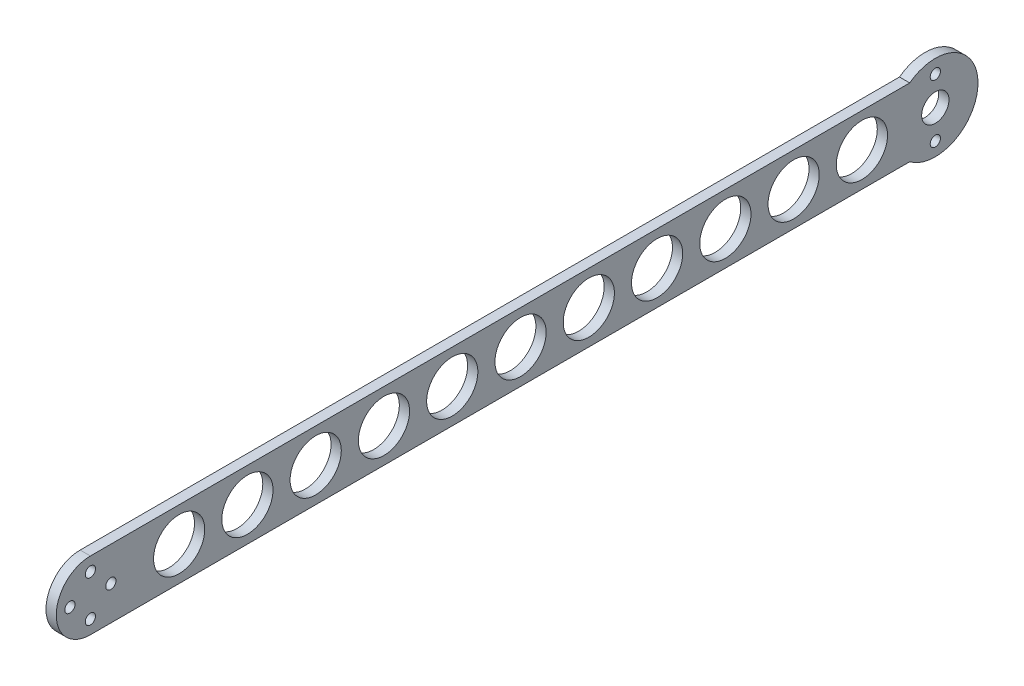
ISO-10303-21;
HEADER;
FILE_DESCRIPTION(('STEP AP214'),'2;1');
FILE_NAME('part.step','',(''),(''),'','','');
FILE_SCHEMA(('AUTOMOTIVE_DESIGN { 1 0 10303 214 1 1 1 1 }'));
ENDSEC;
DATA;
#1=APPLICATION_CONTEXT('core data for automotive mechanical design processes');
#2=APPLICATION_PROTOCOL_DEFINITION('international standard','automotive_design',2000,#1);
#3=PRODUCT_CONTEXT('',#1,'mechanical');
#4=PRODUCT('Part','Part','',(#3));
#5=PRODUCT_RELATED_PRODUCT_CATEGORY('part','',(#4));
#6=PRODUCT_DEFINITION_FORMATION('','',#4);
#7=PRODUCT_DEFINITION_CONTEXT('part definition',#1,'design');
#8=PRODUCT_DEFINITION('design','',#6,#7);
#9=PRODUCT_DEFINITION_SHAPE('','',#8);
#10=(LENGTH_UNIT() NAMED_UNIT(*) SI_UNIT(.MILLI.,.METRE.));
#11=(NAMED_UNIT(*) PLANE_ANGLE_UNIT() SI_UNIT($,.RADIAN.));
#12=(NAMED_UNIT(*) SI_UNIT($,.STERADIAN.) SOLID_ANGLE_UNIT());
#13=UNCERTAINTY_MEASURE_WITH_UNIT(LENGTH_MEASURE(1.E-05),#10,'distance_accuracy_value','');
#14=(GEOMETRIC_REPRESENTATION_CONTEXT(3) GLOBAL_UNCERTAINTY_ASSIGNED_CONTEXT((#13)) GLOBAL_UNIT_ASSIGNED_CONTEXT((#10,
#11,#12)) REPRESENTATION_CONTEXT('',''));
#15=CARTESIAN_POINT('',(0.,0.,0.));
#16=DIRECTION('',(0.,0.,1.));
#17=DIRECTION('',(1.,0.,0.));
#18=AXIS2_PLACEMENT_3D('',#15,#16,#17);
#19=CARTESIAN_POINT('',(3.,0.,-127.5));
#20=DIRECTION('',(-1.,0.,0.));
#21=DIRECTION('',(0.,0.,1.));
#22=AXIS2_PLACEMENT_3D('',#19,#20,#21);
#23=CYLINDRICAL_SURFACE('',#22,12.5);
#24=CARTESIAN_POINT('',(0.,0.,-127.5));
#25=DIRECTION('',(1.,0.,0.));
#26=DIRECTION('',(0.,0.,-1.));
#27=AXIS2_PLACEMENT_3D('',#24,#25,#26);
#28=CIRCLE('',#27,12.5);
#29=CARTESIAN_POINT('',(0.,-10.,-120.));
#30=VERTEX_POINT('',#29);
#31=CARTESIAN_POINT('',(0.,10.,-120.));
#32=VERTEX_POINT('',#31);
#33=EDGE_CURVE('E113',#30,#32,#28,.T.);
#34=ORIENTED_EDGE('',*,*,#33,.T.);
#35=DIRECTION('',(-1.,0.,0.));
#36=VECTOR('',#35,1.);
#37=CARTESIAN_POINT('',(3.,10.,-120.));
#38=LINE('',#37,#36);
#39=CARTESIAN_POINT('',(3.,10.,-120.));
#40=VERTEX_POINT('',#39);
#41=EDGE_CURVE('E11',#40,#32,#38,.T.);
#42=ORIENTED_EDGE('',*,*,#41,.F.);
#43=CARTESIAN_POINT('',(3.,0.,-127.5));
#44=DIRECTION('',(1.,0.,0.));
#45=DIRECTION('',(0.,0.,-1.));
#46=AXIS2_PLACEMENT_3D('',#43,#44,#45);
#47=CIRCLE('',#46,12.5);
#48=CARTESIAN_POINT('',(3.,-10.,-120.));
#49=VERTEX_POINT('',#48);
#50=EDGE_CURVE('E96',#49,#40,#47,.T.);
#51=ORIENTED_EDGE('',*,*,#50,.F.);
#52=DIRECTION('',(-1.,0.,0.));
#53=VECTOR('',#52,1.);
#54=CARTESIAN_POINT('',(3.,-10.,-120.));
#55=LINE('',#54,#53);
#56=EDGE_CURVE('E109',#49,#30,#55,.T.);
#57=ORIENTED_EDGE('',*,*,#56,.T.);
#58=EDGE_LOOP('',(#34,#42,#51,#57));
#59=FACE_BOUND('',#58,.T.);
#60=ADVANCED_FACE('F42',(#59),#23,.T.);
#61=CARTESIAN_POINT('',(3.,10.,120.));
#62=DIRECTION('',(0.,-1.,0.));
#63=DIRECTION('',(0.,0.,-1.));
#64=AXIS2_PLACEMENT_3D('',#61,#62,#63);
#65=PLANE('',#64);
#66=DIRECTION('',(0.,0.,1.));
#67=VECTOR('',#66,1.);
#68=CARTESIAN_POINT('',(0.,10.,120.));
#69=LINE('',#68,#67);
#70=CARTESIAN_POINT('',(0.,10.,120.));
#71=VERTEX_POINT('',#70);
#72=EDGE_CURVE('E101',#32,#71,#69,.T.);
#73=ORIENTED_EDGE('',*,*,#72,.T.);
#74=DIRECTION('',(-1.,0.,0.));
#75=VECTOR('',#74,1.);
#76=CARTESIAN_POINT('',(3.,10.,120.));
#77=LINE('',#76,#75);
#78=CARTESIAN_POINT('',(3.,10.,120.));
#79=VERTEX_POINT('',#78);
#80=EDGE_CURVE('E52',#79,#71,#77,.T.);
#81=ORIENTED_EDGE('',*,*,#80,.F.);
#82=DIRECTION('',(0.,0.,1.));
#83=VECTOR('',#82,1.);
#84=CARTESIAN_POINT('',(3.,10.,120.));
#85=LINE('',#84,#83);
#86=EDGE_CURVE('E91',#40,#79,#85,.T.);
#87=ORIENTED_EDGE('',*,*,#86,.F.);
#88=ORIENTED_EDGE('',*,*,#41,.T.);
#89=EDGE_LOOP('',(#73,#81,#87,#88));
#90=FACE_BOUND('',#89,.T.);
#91=ADVANCED_FACE('F100',(#90),#65,.F.);
#92=CARTESIAN_POINT('',(3.,0.,120.000001884874));
#93=DIRECTION('',(-1.,0.,0.));
#94=DIRECTION('',(0.,0.,1.));
#95=AXIS2_PLACEMENT_3D('',#92,#93,#94);
#96=CYLINDRICAL_SURFACE('',#95,10.0000000000002);
#97=CARTESIAN_POINT('',(0.,0.,120.000001884874));
#98=DIRECTION('',(1.,0.,0.));
#99=DIRECTION('',(0.,0.,-1.));
#100=AXIS2_PLACEMENT_3D('',#97,#98,#99);
#101=CIRCLE('',#100,10.0000000000002);
#102=CARTESIAN_POINT('',(0.,-10.,120.));
#103=VERTEX_POINT('',#102);
#104=EDGE_CURVE('E78',#71,#103,#101,.T.);
#105=ORIENTED_EDGE('',*,*,#104,.T.);
#106=DIRECTION('',(-1.,0.,0.));
#107=VECTOR('',#106,1.);
#108=CARTESIAN_POINT('',(3.,-10.,120.));
#109=LINE('',#108,#107);
#110=CARTESIAN_POINT('',(3.,-10.,120.));
#111=VERTEX_POINT('',#110);
#112=EDGE_CURVE('E103',#111,#103,#109,.T.);
#113=ORIENTED_EDGE('',*,*,#112,.F.);
#114=CARTESIAN_POINT('',(3.,0.,120.000001884874));
#115=DIRECTION('',(1.,0.,0.));
#116=DIRECTION('',(0.,0.,-1.));
#117=AXIS2_PLACEMENT_3D('',#114,#115,#116);
#118=CIRCLE('',#117,10.0000000000002);
#119=EDGE_CURVE('E94',#79,#111,#118,.T.);
#120=ORIENTED_EDGE('',*,*,#119,.F.);
#121=ORIENTED_EDGE('',*,*,#80,.T.);
#122=EDGE_LOOP('',(#105,#113,#120,#121));
#123=FACE_BOUND('',#122,.T.);
#124=ADVANCED_FACE('F105',(#123),#96,.T.);
#125=CARTESIAN_POINT('',(3.,-10.,120.));
#126=DIRECTION('',(0.,1.,0.));
#127=DIRECTION('',(0.,0.,1.));
#128=AXIS2_PLACEMENT_3D('',#125,#126,#127);
#129=PLANE('',#128);
#130=DIRECTION('',(0.,0.,-1.));
#131=VECTOR('',#130,1.);
#132=CARTESIAN_POINT('',(0.,-10.,120.));
#133=LINE('',#132,#131);
#134=EDGE_CURVE('E84',#103,#30,#133,.T.);
#135=ORIENTED_EDGE('',*,*,#134,.T.);
#136=ORIENTED_EDGE('',*,*,#56,.F.);
#137=DIRECTION('',(0.,0.,-1.));
#138=VECTOR('',#137,1.);
#139=CARTESIAN_POINT('',(3.,-10.,120.));
#140=LINE('',#139,#138);
#141=EDGE_CURVE('E61',#111,#49,#140,.T.);
#142=ORIENTED_EDGE('',*,*,#141,.F.);
#143=ORIENTED_EDGE('',*,*,#112,.T.);
#144=EDGE_LOOP('',(#135,#136,#142,#143));
#145=FACE_BOUND('',#144,.T.);
#146=ADVANCED_FACE('F284',(#145),#129,.F.);
#147=CARTESIAN_POINT('',(3.,0.,-127.5));
#148=DIRECTION('',(1.,0.,0.));
#149=DIRECTION('',(0.,0.,-1.));
#150=AXIS2_PLACEMENT_3D('',#147,#148,#149);
#151=PLANE('',#150);
#152=CARTESIAN_POINT('',(3.,0.,94.));
#153=DIRECTION('',(1.,0.,0.));
#154=DIRECTION('',(0.,0.,-1.));
#155=AXIS2_PLACEMENT_3D('',#152,#153,#154);
#156=CIRCLE('',#155,7.50000000000001);
#157=CARTESIAN_POINT('',(3.,0.,86.5));
#158=VERTEX_POINT('',#157);
#159=EDGE_CURVE('E133',#158,#158,#156,.T.);
#160=ORIENTED_EDGE('',*,*,#159,.F.);
#161=EDGE_LOOP('',(#160));
#162=FACE_BOUND('',#161,.T.);
#163=CARTESIAN_POINT('',(3.,0.,74.));
#164=DIRECTION('',(1.,0.,0.));
#165=DIRECTION('',(0.,0.,-1.));
#166=AXIS2_PLACEMENT_3D('',#163,#164,#165);
#167=CIRCLE('',#166,7.50000000000001);
#168=CARTESIAN_POINT('',(3.,0.,66.5));
#169=VERTEX_POINT('',#168);
#170=EDGE_CURVE('E270',#169,#169,#167,.T.);
#171=ORIENTED_EDGE('',*,*,#170,.F.);
#172=EDGE_LOOP('',(#171));
#173=FACE_BOUND('',#172,.T.);
#174=CARTESIAN_POINT('',(3.,0.,54.));
#175=DIRECTION('',(1.,0.,0.));
#176=DIRECTION('',(0.,0.,-1.));
#177=AXIS2_PLACEMENT_3D('',#174,#175,#176);
#178=CIRCLE('',#177,7.50000000000001);
#179=CARTESIAN_POINT('',(3.,0.,46.5));
#180=VERTEX_POINT('',#179);
#181=EDGE_CURVE('E266',#180,#180,#178,.T.);
#182=ORIENTED_EDGE('',*,*,#181,.F.);
#183=EDGE_LOOP('',(#182));
#184=FACE_BOUND('',#183,.T.);
#185=CARTESIAN_POINT('',(3.,0.,34.));
#186=DIRECTION('',(1.,0.,0.));
#187=DIRECTION('',(0.,0.,-1.));
#188=AXIS2_PLACEMENT_3D('',#185,#186,#187);
#189=CIRCLE('',#188,7.50000000000001);
#190=CARTESIAN_POINT('',(3.,0.,26.5));
#191=VERTEX_POINT('',#190);
#192=EDGE_CURVE('E262',#191,#191,#189,.T.);
#193=ORIENTED_EDGE('',*,*,#192,.F.);
#194=EDGE_LOOP('',(#193));
#195=FACE_BOUND('',#194,.T.);
#196=CARTESIAN_POINT('',(3.,0.,14.));
#197=DIRECTION('',(1.,0.,0.));
#198=DIRECTION('',(0.,0.,-1.));
#199=AXIS2_PLACEMENT_3D('',#196,#197,#198);
#200=CIRCLE('',#199,7.50000000000001);
#201=CARTESIAN_POINT('',(3.,0.,6.49999999999997));
#202=VERTEX_POINT('',#201);
#203=EDGE_CURVE('E258',#202,#202,#200,.T.);
#204=ORIENTED_EDGE('',*,*,#203,.F.);
#205=EDGE_LOOP('',(#204));
#206=FACE_BOUND('',#205,.T.);
#207=CARTESIAN_POINT('',(3.,0.,-6.00000000000002));
#208=DIRECTION('',(1.,0.,0.));
#209=DIRECTION('',(0.,0.,-1.));
#210=AXIS2_PLACEMENT_3D('',#207,#208,#209);
#211=CIRCLE('',#210,7.50000000000001);
#212=CARTESIAN_POINT('',(3.,0.,-13.5));
#213=VERTEX_POINT('',#212);
#214=EDGE_CURVE('E254',#213,#213,#211,.T.);
#215=ORIENTED_EDGE('',*,*,#214,.F.);
#216=EDGE_LOOP('',(#215));
#217=FACE_BOUND('',#216,.T.);
#218=CARTESIAN_POINT('',(3.,0.,-26.));
#219=DIRECTION('',(1.,0.,0.));
#220=DIRECTION('',(0.,0.,-1.));
#221=AXIS2_PLACEMENT_3D('',#218,#219,#220);
#222=CIRCLE('',#221,7.50000000000001);
#223=CARTESIAN_POINT('',(3.,0.,-33.5));
#224=VERTEX_POINT('',#223);
#225=EDGE_CURVE('E250',#224,#224,#222,.T.);
#226=ORIENTED_EDGE('',*,*,#225,.F.);
#227=EDGE_LOOP('',(#226));
#228=FACE_BOUND('',#227,.T.);
#229=CARTESIAN_POINT('',(3.,0.,-46.));
#230=DIRECTION('',(1.,0.,0.));
#231=DIRECTION('',(0.,0.,-1.));
#232=AXIS2_PLACEMENT_3D('',#229,#230,#231);
#233=CIRCLE('',#232,7.50000000000001);
#234=CARTESIAN_POINT('',(3.,0.,-53.5));
#235=VERTEX_POINT('',#234);
#236=EDGE_CURVE('E246',#235,#235,#233,.T.);
#237=ORIENTED_EDGE('',*,*,#236,.F.);
#238=EDGE_LOOP('',(#237));
#239=FACE_BOUND('',#238,.T.);
#240=CARTESIAN_POINT('',(3.,0.,-66.));
#241=DIRECTION('',(1.,0.,0.));
#242=DIRECTION('',(0.,0.,-1.));
#243=AXIS2_PLACEMENT_3D('',#240,#241,#242);
#244=CIRCLE('',#243,7.50000000000001);
#245=CARTESIAN_POINT('',(3.,0.,-73.5));
#246=VERTEX_POINT('',#245);
#247=EDGE_CURVE('E242',#246,#246,#244,.T.);
#248=ORIENTED_EDGE('',*,*,#247,.F.);
#249=EDGE_LOOP('',(#248));
#250=FACE_BOUND('',#249,.T.);
#251=CARTESIAN_POINT('',(3.,0.,-86.));
#252=DIRECTION('',(1.,0.,0.));
#253=DIRECTION('',(0.,0.,-1.));
#254=AXIS2_PLACEMENT_3D('',#251,#252,#253);
#255=CIRCLE('',#254,7.50000000000001);
#256=CARTESIAN_POINT('',(3.,0.,-93.5));
#257=VERTEX_POINT('',#256);
#258=EDGE_CURVE('E238',#257,#257,#255,.T.);
#259=ORIENTED_EDGE('',*,*,#258,.F.);
#260=EDGE_LOOP('',(#259));
#261=FACE_BOUND('',#260,.T.);
#262=CARTESIAN_POINT('',(3.,0.,-106.));
#263=DIRECTION('',(1.,0.,0.));
#264=DIRECTION('',(0.,0.,-1.));
#265=AXIS2_PLACEMENT_3D('',#262,#263,#264);
#266=CIRCLE('',#265,7.50000000000001);
#267=CARTESIAN_POINT('',(3.,0.,-113.5));
#268=VERTEX_POINT('',#267);
#269=EDGE_CURVE('E234',#268,#268,#266,.T.);
#270=ORIENTED_EDGE('',*,*,#269,.F.);
#271=EDGE_LOOP('',(#270));
#272=FACE_BOUND('',#271,.T.);
#273=CARTESIAN_POINT('',(3.,-8.49999999999999,-127.5));
#274=DIRECTION('',(1.,0.,0.));
#275=DIRECTION('',(0.,0.,-1.));
#276=AXIS2_PLACEMENT_3D('',#273,#274,#275);
#277=CIRCLE('',#276,1.5);
#278=CARTESIAN_POINT('',(3.,-8.49999999999999,-129.));
#279=VERTEX_POINT('',#278);
#280=EDGE_CURVE('E195',#279,#279,#277,.T.);
#281=ORIENTED_EDGE('',*,*,#280,.F.);
#282=EDGE_LOOP('',(#281));
#283=FACE_BOUND('',#282,.T.);
#284=CARTESIAN_POINT('',(3.,0.,126.));
#285=DIRECTION('',(1.,0.,0.));
#286=DIRECTION('',(0.,0.,-1.));
#287=AXIS2_PLACEMENT_3D('',#284,#285,#286);
#288=CIRCLE('',#287,1.5);
#289=CARTESIAN_POINT('',(3.,0.,124.5));
#290=VERTEX_POINT('',#289);
#291=EDGE_CURVE('E186',#290,#290,#288,.T.);
#292=ORIENTED_EDGE('',*,*,#291,.F.);
#293=EDGE_LOOP('',(#292));
#294=FACE_BOUND('',#293,.T.);
#295=CARTESIAN_POINT('',(3.,-6.,120.));
#296=DIRECTION('',(1.,0.,0.));
#297=DIRECTION('',(0.,0.,-1.));
#298=AXIS2_PLACEMENT_3D('',#295,#296,#297);
#299=CIRCLE('',#298,1.5);
#300=CARTESIAN_POINT('',(3.,-6.,118.5));
#301=VERTEX_POINT('',#300);
#302=EDGE_CURVE('E213',#301,#301,#299,.T.);
#303=ORIENTED_EDGE('',*,*,#302,.F.);
#304=EDGE_LOOP('',(#303));
#305=FACE_BOUND('',#304,.T.);
#306=CARTESIAN_POINT('',(3.,0.,114.));
#307=DIRECTION('',(1.,0.,0.));
#308=DIRECTION('',(0.,0.,-1.));
#309=AXIS2_PLACEMENT_3D('',#306,#307,#308);
#310=CIRCLE('',#309,1.5);
#311=CARTESIAN_POINT('',(3.,0.,112.5));
#312=VERTEX_POINT('',#311);
#313=EDGE_CURVE('E204',#312,#312,#310,.T.);
#314=ORIENTED_EDGE('',*,*,#313,.F.);
#315=EDGE_LOOP('',(#314));
#316=FACE_BOUND('',#315,.T.);
#317=CARTESIAN_POINT('',(3.,0.,-127.5));
#318=DIRECTION('',(1.,0.,0.));
#319=DIRECTION('',(0.,0.,-1.));
#320=AXIS2_PLACEMENT_3D('',#317,#318,#319);
#321=CIRCLE('',#320,3.99999999999999);
#322=CARTESIAN_POINT('',(3.,0.,-131.5));
#323=VERTEX_POINT('',#322);
#324=EDGE_CURVE('E203',#323,#323,#321,.T.);
#325=ORIENTED_EDGE('',*,*,#324,.F.);
#326=EDGE_LOOP('',(#325));
#327=FACE_BOUND('',#326,.T.);
#328=CARTESIAN_POINT('',(3.,8.49999999999999,-127.5));
#329=DIRECTION('',(1.,0.,0.));
#330=DIRECTION('',(0.,0.,-1.));
#331=AXIS2_PLACEMENT_3D('',#328,#329,#330);
#332=CIRCLE('',#331,1.5);
#333=CARTESIAN_POINT('',(3.,8.49999999999999,-129.));
#334=VERTEX_POINT('',#333);
#335=EDGE_CURVE('E176',#334,#334,#332,.T.);
#336=ORIENTED_EDGE('',*,*,#335,.F.);
#337=EDGE_LOOP('',(#336));
#338=FACE_BOUND('',#337,.T.);
#339=CARTESIAN_POINT('',(3.,6.,120.));
#340=DIRECTION('',(1.,0.,0.));
#341=DIRECTION('',(0.,0.,-1.));
#342=AXIS2_PLACEMENT_3D('',#339,#340,#341);
#343=CIRCLE('',#342,1.5);
#344=CARTESIAN_POINT('',(3.,6.,118.5));
#345=VERTEX_POINT('',#344);
#346=EDGE_CURVE('E208',#345,#345,#343,.T.);
#347=ORIENTED_EDGE('',*,*,#346,.F.);
#348=EDGE_LOOP('',(#347));
#349=FACE_BOUND('',#348,.T.);
#350=ORIENTED_EDGE('',*,*,#50,.T.);
#351=ORIENTED_EDGE('',*,*,#86,.T.);
#352=ORIENTED_EDGE('',*,*,#119,.T.);
#353=ORIENTED_EDGE('',*,*,#141,.T.);
#354=EDGE_LOOP('',(#350,#351,#352,#353));
#355=FACE_BOUND('',#354,.T.);
#356=ADVANCED_FACE('F92',(#162,#173,#184,#195,#206,#217,#228,#239,#250,#261,#272,#283,#294,#305,
#316,#327,#338,#349,#355),#151,.T.);
#357=CARTESIAN_POINT('',(0.,0.,-127.5));
#358=DIRECTION('',(1.,0.,0.));
#359=DIRECTION('',(0.,0.,-1.));
#360=AXIS2_PLACEMENT_3D('',#357,#358,#359);
#361=PLANE('',#360);
#362=CARTESIAN_POINT('',(0.,0.,94.));
#363=DIRECTION('',(1.,0.,0.));
#364=DIRECTION('',(0.,0.,-1.));
#365=AXIS2_PLACEMENT_3D('',#362,#363,#364);
#366=CIRCLE('',#365,7.50000000000001);
#367=CARTESIAN_POINT('',(0.,0.,86.5));
#368=VERTEX_POINT('',#367);
#369=EDGE_CURVE('E45',#368,#368,#366,.T.);
#370=ORIENTED_EDGE('',*,*,#369,.T.);
#371=EDGE_LOOP('',(#370));
#372=FACE_BOUND('',#371,.T.);
#373=CARTESIAN_POINT('',(0.,0.,74.));
#374=DIRECTION('',(1.,0.,0.));
#375=DIRECTION('',(0.,0.,-1.));
#376=AXIS2_PLACEMENT_3D('',#373,#374,#375);
#377=CIRCLE('',#376,7.50000000000001);
#378=CARTESIAN_POINT('',(0.,0.,66.5));
#379=VERTEX_POINT('',#378);
#380=EDGE_CURVE('E164',#379,#379,#377,.T.);
#381=ORIENTED_EDGE('',*,*,#380,.T.);
#382=EDGE_LOOP('',(#381));
#383=FACE_BOUND('',#382,.T.);
#384=CARTESIAN_POINT('',(0.,0.,54.));
#385=DIRECTION('',(1.,0.,0.));
#386=DIRECTION('',(0.,0.,-1.));
#387=AXIS2_PLACEMENT_3D('',#384,#385,#386);
#388=CIRCLE('',#387,7.50000000000001);
#389=CARTESIAN_POINT('',(0.,0.,46.5));
#390=VERTEX_POINT('',#389);
#391=EDGE_CURVE('E161',#390,#390,#388,.T.);
#392=ORIENTED_EDGE('',*,*,#391,.T.);
#393=EDGE_LOOP('',(#392));
#394=FACE_BOUND('',#393,.T.);
#395=CARTESIAN_POINT('',(0.,0.,34.));
#396=DIRECTION('',(1.,0.,0.));
#397=DIRECTION('',(0.,0.,-1.));
#398=AXIS2_PLACEMENT_3D('',#395,#396,#397);
#399=CIRCLE('',#398,7.50000000000001);
#400=CARTESIAN_POINT('',(0.,0.,26.5));
#401=VERTEX_POINT('',#400);
#402=EDGE_CURVE('E157',#401,#401,#399,.T.);
#403=ORIENTED_EDGE('',*,*,#402,.T.);
#404=EDGE_LOOP('',(#403));
#405=FACE_BOUND('',#404,.T.);
#406=CARTESIAN_POINT('',(0.,0.,14.));
#407=DIRECTION('',(1.,0.,0.));
#408=DIRECTION('',(0.,0.,-1.));
#409=AXIS2_PLACEMENT_3D('',#406,#407,#408);
#410=CIRCLE('',#409,7.50000000000001);
#411=CARTESIAN_POINT('',(0.,0.,6.49999999999997));
#412=VERTEX_POINT('',#411);
#413=EDGE_CURVE('E153',#412,#412,#410,.T.);
#414=ORIENTED_EDGE('',*,*,#413,.T.);
#415=EDGE_LOOP('',(#414));
#416=FACE_BOUND('',#415,.T.);
#417=CARTESIAN_POINT('',(0.,0.,-6.00000000000002));
#418=DIRECTION('',(1.,0.,0.));
#419=DIRECTION('',(0.,0.,-1.));
#420=AXIS2_PLACEMENT_3D('',#417,#418,#419);
#421=CIRCLE('',#420,7.50000000000001);
#422=CARTESIAN_POINT('',(0.,0.,-13.5));
#423=VERTEX_POINT('',#422);
#424=EDGE_CURVE('E149',#423,#423,#421,.T.);
#425=ORIENTED_EDGE('',*,*,#424,.T.);
#426=EDGE_LOOP('',(#425));
#427=FACE_BOUND('',#426,.T.);
#428=CARTESIAN_POINT('',(0.,0.,-26.));
#429=DIRECTION('',(1.,0.,0.));
#430=DIRECTION('',(0.,0.,-1.));
#431=AXIS2_PLACEMENT_3D('',#428,#429,#430);
#432=CIRCLE('',#431,7.50000000000001);
#433=CARTESIAN_POINT('',(0.,0.,-33.5));
#434=VERTEX_POINT('',#433);
#435=EDGE_CURVE('E145',#434,#434,#432,.T.);
#436=ORIENTED_EDGE('',*,*,#435,.T.);
#437=EDGE_LOOP('',(#436));
#438=FACE_BOUND('',#437,.T.);
#439=CARTESIAN_POINT('',(0.,0.,-46.));
#440=DIRECTION('',(1.,0.,0.));
#441=DIRECTION('',(0.,0.,-1.));
#442=AXIS2_PLACEMENT_3D('',#439,#440,#441);
#443=CIRCLE('',#442,7.50000000000001);
#444=CARTESIAN_POINT('',(0.,0.,-53.5));
#445=VERTEX_POINT('',#444);
#446=EDGE_CURVE('E141',#445,#445,#443,.T.);
#447=ORIENTED_EDGE('',*,*,#446,.T.);
#448=EDGE_LOOP('',(#447));
#449=FACE_BOUND('',#448,.T.);
#450=CARTESIAN_POINT('',(0.,0.,-66.));
#451=DIRECTION('',(1.,0.,0.));
#452=DIRECTION('',(0.,0.,-1.));
#453=AXIS2_PLACEMENT_3D('',#450,#451,#452);
#454=CIRCLE('',#453,7.50000000000001);
#455=CARTESIAN_POINT('',(0.,0.,-73.5));
#456=VERTEX_POINT('',#455);
#457=EDGE_CURVE('E137',#456,#456,#454,.T.);
#458=ORIENTED_EDGE('',*,*,#457,.T.);
#459=EDGE_LOOP('',(#458));
#460=FACE_BOUND('',#459,.T.);
#461=CARTESIAN_POINT('',(0.,0.,-86.));
#462=DIRECTION('',(1.,0.,0.));
#463=DIRECTION('',(0.,0.,-1.));
#464=AXIS2_PLACEMENT_3D('',#461,#462,#463);
#465=CIRCLE('',#464,7.50000000000001);
#466=CARTESIAN_POINT('',(0.,0.,-93.5));
#467=VERTEX_POINT('',#466);
#468=EDGE_CURVE('E132',#467,#467,#465,.T.);
#469=ORIENTED_EDGE('',*,*,#468,.T.);
#470=EDGE_LOOP('',(#469));
#471=FACE_BOUND('',#470,.T.);
#472=CARTESIAN_POINT('',(0.,0.,-106.));
#473=DIRECTION('',(1.,0.,0.));
#474=DIRECTION('',(0.,0.,-1.));
#475=AXIS2_PLACEMENT_3D('',#472,#473,#474);
#476=CIRCLE('',#475,7.50000000000001);
#477=CARTESIAN_POINT('',(0.,0.,-113.5));
#478=VERTEX_POINT('',#477);
#479=EDGE_CURVE('E128',#478,#478,#476,.T.);
#480=ORIENTED_EDGE('',*,*,#479,.T.);
#481=EDGE_LOOP('',(#480));
#482=FACE_BOUND('',#481,.T.);
#483=CARTESIAN_POINT('',(0.,-8.49999999999999,-127.5));
#484=DIRECTION('',(1.,0.,0.));
#485=DIRECTION('',(0.,0.,-1.));
#486=AXIS2_PLACEMENT_3D('',#483,#484,#485);
#487=CIRCLE('',#486,1.5);
#488=CARTESIAN_POINT('',(0.,-8.49999999999999,-129.));
#489=VERTEX_POINT('',#488);
#490=EDGE_CURVE('E199',#489,#489,#487,.T.);
#491=ORIENTED_EDGE('',*,*,#490,.T.);
#492=EDGE_LOOP('',(#491));
#493=FACE_BOUND('',#492,.T.);
#494=CARTESIAN_POINT('',(0.,0.,126.));
#495=DIRECTION('',(1.,0.,0.));
#496=DIRECTION('',(0.,0.,-1.));
#497=AXIS2_PLACEMENT_3D('',#494,#495,#496);
#498=CIRCLE('',#497,1.5);
#499=CARTESIAN_POINT('',(0.,0.,124.5));
#500=VERTEX_POINT('',#499);
#501=EDGE_CURVE('E191',#500,#500,#498,.T.);
#502=ORIENTED_EDGE('',*,*,#501,.T.);
#503=EDGE_LOOP('',(#502));
#504=FACE_BOUND('',#503,.T.);
#505=CARTESIAN_POINT('',(0.,-6.,120.));
#506=DIRECTION('',(1.,0.,0.));
#507=DIRECTION('',(0.,0.,-1.));
#508=AXIS2_PLACEMENT_3D('',#505,#506,#507);
#509=CIRCLE('',#508,1.5);
#510=CARTESIAN_POINT('',(0.,-6.,118.5));
#511=VERTEX_POINT('',#510);
#512=EDGE_CURVE('E190',#511,#511,#509,.T.);
#513=ORIENTED_EDGE('',*,*,#512,.T.);
#514=EDGE_LOOP('',(#513));
#515=FACE_BOUND('',#514,.T.);
#516=CARTESIAN_POINT('',(0.,0.,114.));
#517=DIRECTION('',(1.,0.,0.));
#518=DIRECTION('',(0.,0.,-1.));
#519=AXIS2_PLACEMENT_3D('',#516,#517,#518);
#520=CIRCLE('',#519,1.5);
#521=CARTESIAN_POINT('',(0.,0.,112.5));
#522=VERTEX_POINT('',#521);
#523=EDGE_CURVE('E209',#522,#522,#520,.T.);
#524=ORIENTED_EDGE('',*,*,#523,.T.);
#525=EDGE_LOOP('',(#524));
#526=FACE_BOUND('',#525,.T.);
#527=CARTESIAN_POINT('',(0.,0.,-127.5));
#528=DIRECTION('',(1.,0.,0.));
#529=DIRECTION('',(0.,0.,-1.));
#530=AXIS2_PLACEMENT_3D('',#527,#528,#529);
#531=CIRCLE('',#530,3.99999999999999);
#532=CARTESIAN_POINT('',(0.,0.,-131.5));
#533=VERTEX_POINT('',#532);
#534=EDGE_CURVE('E182',#533,#533,#531,.T.);
#535=ORIENTED_EDGE('',*,*,#534,.T.);
#536=EDGE_LOOP('',(#535));
#537=FACE_BOUND('',#536,.T.);
#538=CARTESIAN_POINT('',(0.,8.49999999999999,-127.5));
#539=DIRECTION('',(1.,0.,0.));
#540=DIRECTION('',(0.,0.,-1.));
#541=AXIS2_PLACEMENT_3D('',#538,#539,#540);
#542=CIRCLE('',#541,1.5);
#543=CARTESIAN_POINT('',(0.,8.49999999999999,-129.));
#544=VERTEX_POINT('',#543);
#545=EDGE_CURVE('E171',#544,#544,#542,.T.);
#546=ORIENTED_EDGE('',*,*,#545,.T.);
#547=EDGE_LOOP('',(#546));
#548=FACE_BOUND('',#547,.T.);
#549=CARTESIAN_POINT('',(0.,6.,120.));
#550=DIRECTION('',(1.,0.,0.));
#551=DIRECTION('',(0.,0.,-1.));
#552=AXIS2_PLACEMENT_3D('',#549,#550,#551);
#553=CIRCLE('',#552,1.5);
#554=CARTESIAN_POINT('',(0.,6.,118.5));
#555=VERTEX_POINT('',#554);
#556=EDGE_CURVE('E117',#555,#555,#553,.T.);
#557=ORIENTED_EDGE('',*,*,#556,.T.);
#558=EDGE_LOOP('',(#557));
#559=FACE_BOUND('',#558,.T.);
#560=ORIENTED_EDGE('',*,*,#33,.F.);
#561=ORIENTED_EDGE('',*,*,#134,.F.);
#562=ORIENTED_EDGE('',*,*,#104,.F.);
#563=ORIENTED_EDGE('',*,*,#72,.F.);
#564=EDGE_LOOP('',(#560,#561,#562,#563));
#565=FACE_BOUND('',#564,.T.);
#566=ADVANCED_FACE('F283',(#372,#383,#394,#405,#416,#427,#438,#449,#460,#471,#482,#493,#504,
#515,#526,#537,#548,#559,#565),#361,.F.);
#567=CARTESIAN_POINT('',(0.,6.,120.));
#568=DIRECTION('',(1.,0.,0.));
#569=DIRECTION('',(0.,0.,-1.));
#570=AXIS2_PLACEMENT_3D('',#567,#568,#569);
#571=CYLINDRICAL_SURFACE('',#570,1.5);
#572=ORIENTED_EDGE('',*,*,#556,.F.);
#573=EDGE_LOOP('',(#572));
#574=FACE_BOUND('',#573,.T.);
#575=ORIENTED_EDGE('',*,*,#346,.T.);
#576=EDGE_LOOP('',(#575));
#577=FACE_BOUND('',#576,.T.);
#578=ADVANCED_FACE('F320',(#574,#577),#571,.F.);
#579=CARTESIAN_POINT('',(0.,8.49999999999999,-127.5));
#580=DIRECTION('',(1.,0.,0.));
#581=DIRECTION('',(0.,0.,-1.));
#582=AXIS2_PLACEMENT_3D('',#579,#580,#581);
#583=CYLINDRICAL_SURFACE('',#582,1.5);
#584=ORIENTED_EDGE('',*,*,#545,.F.);
#585=EDGE_LOOP('',(#584));
#586=FACE_BOUND('',#585,.T.);
#587=ORIENTED_EDGE('',*,*,#335,.T.);
#588=EDGE_LOOP('',(#587));
#589=FACE_BOUND('',#588,.T.);
#590=ADVANCED_FACE('F322',(#586,#589),#583,.F.);
#591=CARTESIAN_POINT('',(0.,0.,-127.5));
#592=DIRECTION('',(1.,0.,0.));
#593=DIRECTION('',(0.,0.,-1.));
#594=AXIS2_PLACEMENT_3D('',#591,#592,#593);
#595=CYLINDRICAL_SURFACE('',#594,3.99999999999999);
#596=ORIENTED_EDGE('',*,*,#534,.F.);
#597=EDGE_LOOP('',(#596));
#598=FACE_BOUND('',#597,.T.);
#599=ORIENTED_EDGE('',*,*,#324,.T.);
#600=EDGE_LOOP('',(#599));
#601=FACE_BOUND('',#600,.T.);
#602=ADVANCED_FACE('F329',(#598,#601),#595,.F.);
#603=CARTESIAN_POINT('',(0.,0.,114.));
#604=DIRECTION('',(1.,0.,0.));
#605=DIRECTION('',(0.,0.,-1.));
#606=AXIS2_PLACEMENT_3D('',#603,#604,#605);
#607=CYLINDRICAL_SURFACE('',#606,1.5);
#608=ORIENTED_EDGE('',*,*,#523,.F.);
#609=EDGE_LOOP('',(#608));
#610=FACE_BOUND('',#609,.T.);
#611=ORIENTED_EDGE('',*,*,#313,.T.);
#612=EDGE_LOOP('',(#611));
#613=FACE_BOUND('',#612,.T.);
#614=ADVANCED_FACE('F403',(#610,#613),#607,.F.);
#615=CARTESIAN_POINT('',(0.,-6.,120.));
#616=DIRECTION('',(1.,0.,0.));
#617=DIRECTION('',(0.,0.,-1.));
#618=AXIS2_PLACEMENT_3D('',#615,#616,#617);
#619=CYLINDRICAL_SURFACE('',#618,1.5);
#620=ORIENTED_EDGE('',*,*,#512,.F.);
#621=EDGE_LOOP('',(#620));
#622=FACE_BOUND('',#621,.T.);
#623=ORIENTED_EDGE('',*,*,#302,.T.);
#624=EDGE_LOOP('',(#623));
#625=FACE_BOUND('',#624,.T.);
#626=ADVANCED_FACE('F413',(#622,#625),#619,.F.);
#627=CARTESIAN_POINT('',(0.,0.,126.));
#628=DIRECTION('',(1.,0.,0.));
#629=DIRECTION('',(0.,0.,-1.));
#630=AXIS2_PLACEMENT_3D('',#627,#628,#629);
#631=CYLINDRICAL_SURFACE('',#630,1.5);
#632=ORIENTED_EDGE('',*,*,#501,.F.);
#633=EDGE_LOOP('',(#632));
#634=FACE_BOUND('',#633,.T.);
#635=ORIENTED_EDGE('',*,*,#291,.T.);
#636=EDGE_LOOP('',(#635));
#637=FACE_BOUND('',#636,.T.);
#638=ADVANCED_FACE('F423',(#634,#637),#631,.F.);
#639=CARTESIAN_POINT('',(0.,-8.49999999999999,-127.5));
#640=DIRECTION('',(1.,0.,0.));
#641=DIRECTION('',(0.,0.,-1.));
#642=AXIS2_PLACEMENT_3D('',#639,#640,#641);
#643=CYLINDRICAL_SURFACE('',#642,1.5);
#644=ORIENTED_EDGE('',*,*,#490,.F.);
#645=EDGE_LOOP('',(#644));
#646=FACE_BOUND('',#645,.T.);
#647=ORIENTED_EDGE('',*,*,#280,.T.);
#648=EDGE_LOOP('',(#647));
#649=FACE_BOUND('',#648,.T.);
#650=ADVANCED_FACE('F432',(#646,#649),#643,.F.);
#651=CARTESIAN_POINT('',(-247.,0.,-106.));
#652=DIRECTION('',(1.,0.,0.));
#653=DIRECTION('',(0.,0.,-1.));
#654=AXIS2_PLACEMENT_3D('',#651,#652,#653);
#655=CYLINDRICAL_SURFACE('',#654,7.50000000000001);
#656=ORIENTED_EDGE('',*,*,#269,.T.);
#657=EDGE_LOOP('',(#656));
#658=FACE_BOUND('',#657,.T.);
#659=ORIENTED_EDGE('',*,*,#479,.F.);
#660=EDGE_LOOP('',(#659));
#661=FACE_BOUND('',#660,.T.);
#662=ADVANCED_FACE('F442',(#658,#661),#655,.F.);
#663=CARTESIAN_POINT('',(-247.,0.,-86.));
#664=DIRECTION('',(1.,0.,0.));
#665=DIRECTION('',(0.,0.,-1.));
#666=AXIS2_PLACEMENT_3D('',#663,#664,#665);
#667=CYLINDRICAL_SURFACE('',#666,7.50000000000001);
#668=ORIENTED_EDGE('',*,*,#258,.T.);
#669=EDGE_LOOP('',(#668));
#670=FACE_BOUND('',#669,.T.);
#671=ORIENTED_EDGE('',*,*,#468,.F.);
#672=EDGE_LOOP('',(#671));
#673=FACE_BOUND('',#672,.T.);
#674=ADVANCED_FACE('F452',(#670,#673),#667,.F.);
#675=CARTESIAN_POINT('',(-247.,0.,-66.));
#676=DIRECTION('',(1.,0.,0.));
#677=DIRECTION('',(0.,0.,-1.));
#678=AXIS2_PLACEMENT_3D('',#675,#676,#677);
#679=CYLINDRICAL_SURFACE('',#678,7.50000000000001);
#680=ORIENTED_EDGE('',*,*,#247,.T.);
#681=EDGE_LOOP('',(#680));
#682=FACE_BOUND('',#681,.T.);
#683=ORIENTED_EDGE('',*,*,#457,.F.);
#684=EDGE_LOOP('',(#683));
#685=FACE_BOUND('',#684,.T.);
#686=ADVANCED_FACE('F462',(#682,#685),#679,.F.);
#687=CARTESIAN_POINT('',(-247.,0.,-46.));
#688=DIRECTION('',(1.,0.,0.));
#689=DIRECTION('',(0.,0.,-1.));
#690=AXIS2_PLACEMENT_3D('',#687,#688,#689);
#691=CYLINDRICAL_SURFACE('',#690,7.50000000000001);
#692=ORIENTED_EDGE('',*,*,#236,.T.);
#693=EDGE_LOOP('',(#692));
#694=FACE_BOUND('',#693,.T.);
#695=ORIENTED_EDGE('',*,*,#446,.F.);
#696=EDGE_LOOP('',(#695));
#697=FACE_BOUND('',#696,.T.);
#698=ADVANCED_FACE('F472',(#694,#697),#691,.F.);
#699=CARTESIAN_POINT('',(-247.,0.,-26.));
#700=DIRECTION('',(1.,0.,0.));
#701=DIRECTION('',(0.,0.,-1.));
#702=AXIS2_PLACEMENT_3D('',#699,#700,#701);
#703=CYLINDRICAL_SURFACE('',#702,7.50000000000001);
#704=ORIENTED_EDGE('',*,*,#225,.T.);
#705=EDGE_LOOP('',(#704));
#706=FACE_BOUND('',#705,.T.);
#707=ORIENTED_EDGE('',*,*,#435,.F.);
#708=EDGE_LOOP('',(#707));
#709=FACE_BOUND('',#708,.T.);
#710=ADVANCED_FACE('F482',(#706,#709),#703,.F.);
#711=CARTESIAN_POINT('',(-247.,0.,-6.00000000000002));
#712=DIRECTION('',(1.,0.,0.));
#713=DIRECTION('',(0.,0.,-1.));
#714=AXIS2_PLACEMENT_3D('',#711,#712,#713);
#715=CYLINDRICAL_SURFACE('',#714,7.50000000000001);
#716=ORIENTED_EDGE('',*,*,#214,.T.);
#717=EDGE_LOOP('',(#716));
#718=FACE_BOUND('',#717,.T.);
#719=ORIENTED_EDGE('',*,*,#424,.F.);
#720=EDGE_LOOP('',(#719));
#721=FACE_BOUND('',#720,.T.);
#722=ADVANCED_FACE('F492',(#718,#721),#715,.F.);
#723=CARTESIAN_POINT('',(-247.,0.,14.));
#724=DIRECTION('',(1.,0.,0.));
#725=DIRECTION('',(0.,0.,-1.));
#726=AXIS2_PLACEMENT_3D('',#723,#724,#725);
#727=CYLINDRICAL_SURFACE('',#726,7.50000000000001);
#728=ORIENTED_EDGE('',*,*,#203,.T.);
#729=EDGE_LOOP('',(#728));
#730=FACE_BOUND('',#729,.T.);
#731=ORIENTED_EDGE('',*,*,#413,.F.);
#732=EDGE_LOOP('',(#731));
#733=FACE_BOUND('',#732,.T.);
#734=ADVANCED_FACE('F502',(#730,#733),#727,.F.);
#735=CARTESIAN_POINT('',(-247.,0.,34.));
#736=DIRECTION('',(1.,0.,0.));
#737=DIRECTION('',(0.,0.,-1.));
#738=AXIS2_PLACEMENT_3D('',#735,#736,#737);
#739=CYLINDRICAL_SURFACE('',#738,7.50000000000001);
#740=ORIENTED_EDGE('',*,*,#192,.T.);
#741=EDGE_LOOP('',(#740));
#742=FACE_BOUND('',#741,.T.);
#743=ORIENTED_EDGE('',*,*,#402,.F.);
#744=EDGE_LOOP('',(#743));
#745=FACE_BOUND('',#744,.T.);
#746=ADVANCED_FACE('F512',(#742,#745),#739,.F.);
#747=CARTESIAN_POINT('',(-247.,0.,54.));
#748=DIRECTION('',(1.,0.,0.));
#749=DIRECTION('',(0.,0.,-1.));
#750=AXIS2_PLACEMENT_3D('',#747,#748,#749);
#751=CYLINDRICAL_SURFACE('',#750,7.50000000000001);
#752=ORIENTED_EDGE('',*,*,#181,.T.);
#753=EDGE_LOOP('',(#752));
#754=FACE_BOUND('',#753,.T.);
#755=ORIENTED_EDGE('',*,*,#391,.F.);
#756=EDGE_LOOP('',(#755));
#757=FACE_BOUND('',#756,.T.);
#758=ADVANCED_FACE('F522',(#754,#757),#751,.F.);
#759=CARTESIAN_POINT('',(-247.,0.,74.));
#760=DIRECTION('',(1.,0.,0.));
#761=DIRECTION('',(0.,0.,-1.));
#762=AXIS2_PLACEMENT_3D('',#759,#760,#761);
#763=CYLINDRICAL_SURFACE('',#762,7.50000000000001);
#764=ORIENTED_EDGE('',*,*,#170,.T.);
#765=EDGE_LOOP('',(#764));
#766=FACE_BOUND('',#765,.T.);
#767=ORIENTED_EDGE('',*,*,#380,.F.);
#768=EDGE_LOOP('',(#767));
#769=FACE_BOUND('',#768,.T.);
#770=ADVANCED_FACE('F532',(#766,#769),#763,.F.);
#771=CARTESIAN_POINT('',(-247.,0.,94.));
#772=DIRECTION('',(1.,0.,0.));
#773=DIRECTION('',(0.,0.,-1.));
#774=AXIS2_PLACEMENT_3D('',#771,#772,#773);
#775=CYLINDRICAL_SURFACE('',#774,7.50000000000001);
#776=ORIENTED_EDGE('',*,*,#159,.T.);
#777=EDGE_LOOP('',(#776));
#778=FACE_BOUND('',#777,.T.);
#779=ORIENTED_EDGE('',*,*,#369,.F.);
#780=EDGE_LOOP('',(#779));
#781=FACE_BOUND('',#780,.T.);
#782=ADVANCED_FACE('F278',(#778,#781),#775,.F.);
#783=CLOSED_SHELL('',(#60,#91,#124,#146,#356,#566,#578,#590,#602,#614,#626,#638,#650,#662,#674,
#686,#698,#710,#722,#734,#746,#758,#770,#782));
#784=MANIFOLD_SOLID_BREP('B2',#783);
#785=ADVANCED_BREP_SHAPE_REPRESENTATION('',(#18,#784),#14);
#786=SHAPE_DEFINITION_REPRESENTATION(#9,#785);
ENDSEC;
END-ISO-10303-21;
